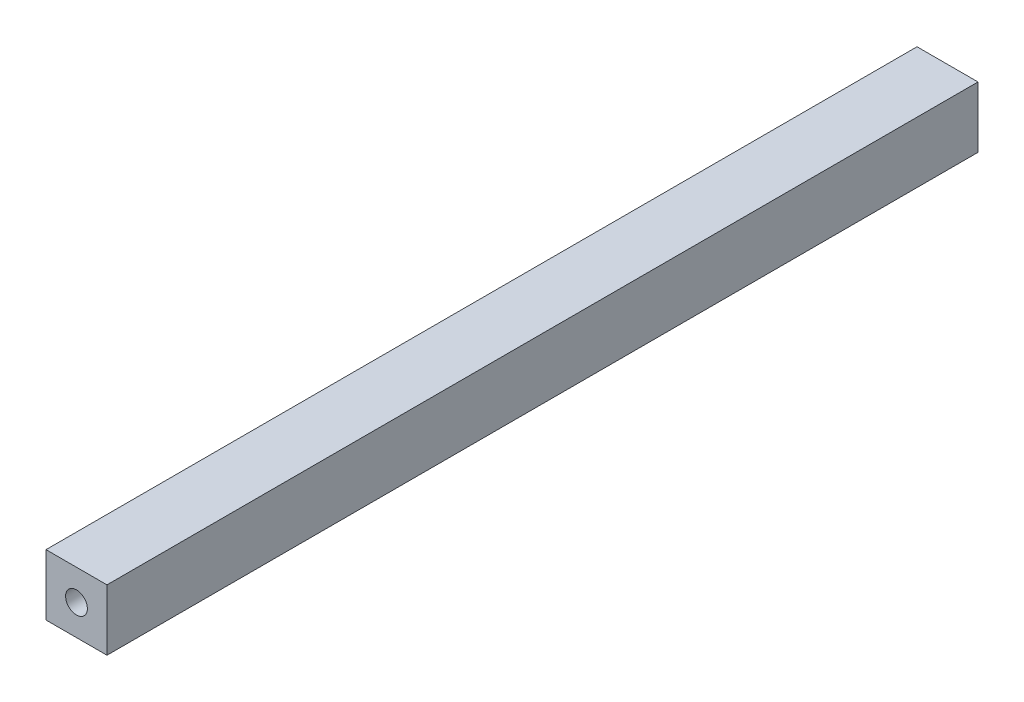
ISO-10303-21;
HEADER;
FILE_DESCRIPTION(('STEP AP214'),'2;1');
FILE_NAME('part.step','',(''),(''),'','','');
FILE_SCHEMA(('AUTOMOTIVE_DESIGN { 1 0 10303 214 1 1 1 1 }'));
ENDSEC;
DATA;
#1=APPLICATION_CONTEXT('core data for automotive mechanical design processes');
#2=APPLICATION_PROTOCOL_DEFINITION('international standard','automotive_design',2000,#1);
#3=PRODUCT_CONTEXT('',#1,'mechanical');
#4=PRODUCT('Part','Part','',(#3));
#5=PRODUCT_RELATED_PRODUCT_CATEGORY('part','',(#4));
#6=PRODUCT_DEFINITION_FORMATION('','',#4);
#7=PRODUCT_DEFINITION_CONTEXT('part definition',#1,'design');
#8=PRODUCT_DEFINITION('design','',#6,#7);
#9=PRODUCT_DEFINITION_SHAPE('','',#8);
#10=(LENGTH_UNIT() NAMED_UNIT(*) SI_UNIT(.MILLI.,.METRE.));
#11=(NAMED_UNIT(*) PLANE_ANGLE_UNIT() SI_UNIT($,.RADIAN.));
#12=(NAMED_UNIT(*) SI_UNIT($,.STERADIAN.) SOLID_ANGLE_UNIT());
#13=UNCERTAINTY_MEASURE_WITH_UNIT(LENGTH_MEASURE(1.E-05),#10,'distance_accuracy_value','');
#14=(GEOMETRIC_REPRESENTATION_CONTEXT(3) GLOBAL_UNCERTAINTY_ASSIGNED_CONTEXT((#13)) GLOBAL_UNIT_ASSIGNED_CONTEXT((#10,
#11,#12)) REPRESENTATION_CONTEXT('',''));
#15=CARTESIAN_POINT('',(0.,0.,0.));
#16=DIRECTION('',(0.,0.,1.));
#17=DIRECTION('',(1.,0.,0.));
#18=AXIS2_PLACEMENT_3D('',#15,#16,#17);
#19=CARTESIAN_POINT('',(17.78,17.78,508.));
#20=DIRECTION('',(-1.,0.,0.));
#21=DIRECTION('',(0.,-1.,0.));
#22=AXIS2_PLACEMENT_3D('',#19,#20,#21);
#23=PLANE('',#22);
#24=DIRECTION('',(0.,1.,0.));
#25=VECTOR('',#24,1.);
#26=CARTESIAN_POINT('',(17.78,17.78,0.));
#27=LINE('',#26,#25);
#28=CARTESIAN_POINT('',(17.78,-17.78,0.));
#29=VERTEX_POINT('',#28);
#30=CARTESIAN_POINT('',(17.78,17.78,0.));
#31=VERTEX_POINT('',#30);
#32=EDGE_CURVE('E119',#29,#31,#27,.T.);
#33=ORIENTED_EDGE('',*,*,#32,.T.);
#34=DIRECTION('',(0.,0.,-1.));
#35=VECTOR('',#34,1.);
#36=CARTESIAN_POINT('',(17.78,17.78,508.));
#37=LINE('',#36,#35);
#38=CARTESIAN_POINT('',(17.78,17.78,508.));
#39=VERTEX_POINT('',#38);
#40=EDGE_CURVE('E11',#39,#31,#37,.T.);
#41=ORIENTED_EDGE('',*,*,#40,.F.);
#42=DIRECTION('',(0.,1.,0.));
#43=VECTOR('',#42,1.);
#44=CARTESIAN_POINT('',(17.78,17.78,508.));
#45=LINE('',#44,#43);
#46=CARTESIAN_POINT('',(17.78,-17.78,508.));
#47=VERTEX_POINT('',#46);
#48=EDGE_CURVE('E101',#47,#39,#45,.T.);
#49=ORIENTED_EDGE('',*,*,#48,.F.);
#50=DIRECTION('',(0.,0.,-1.));
#51=VECTOR('',#50,1.);
#52=CARTESIAN_POINT('',(17.78,-17.78,508.));
#53=LINE('',#52,#51);
#54=EDGE_CURVE('E115',#47,#29,#53,.T.);
#55=ORIENTED_EDGE('',*,*,#54,.T.);
#56=EDGE_LOOP('',(#33,#41,#49,#55));
#57=FACE_BOUND('',#56,.T.);
#58=ADVANCED_FACE('F49',(#57),#23,.F.);
#59=CARTESIAN_POINT('',(-17.78,17.78,508.));
#60=DIRECTION('',(0.,-1.,0.));
#61=DIRECTION('',(0.,0.,-1.));
#62=AXIS2_PLACEMENT_3D('',#59,#60,#61);
#63=PLANE('',#62);
#64=DIRECTION('',(-1.,0.,0.));
#65=VECTOR('',#64,1.);
#66=CARTESIAN_POINT('',(-17.78,17.78,0.));
#67=LINE('',#66,#65);
#68=CARTESIAN_POINT('',(-17.78,17.78,0.));
#69=VERTEX_POINT('',#68);
#70=EDGE_CURVE('E106',#31,#69,#67,.T.);
#71=ORIENTED_EDGE('',*,*,#70,.T.);
#72=DIRECTION('',(0.,0.,-1.));
#73=VECTOR('',#72,1.);
#74=CARTESIAN_POINT('',(-17.78,17.78,508.));
#75=LINE('',#74,#73);
#76=CARTESIAN_POINT('',(-17.78,17.78,508.));
#77=VERTEX_POINT('',#76);
#78=EDGE_CURVE('E58',#77,#69,#75,.T.);
#79=ORIENTED_EDGE('',*,*,#78,.F.);
#80=DIRECTION('',(-1.,0.,0.));
#81=VECTOR('',#80,1.);
#82=CARTESIAN_POINT('',(-17.78,17.78,508.));
#83=LINE('',#82,#81);
#84=EDGE_CURVE('E96',#39,#77,#83,.T.);
#85=ORIENTED_EDGE('',*,*,#84,.F.);
#86=ORIENTED_EDGE('',*,*,#40,.T.);
#87=EDGE_LOOP('',(#71,#79,#85,#86));
#88=FACE_BOUND('',#87,.T.);
#89=ADVANCED_FACE('F105',(#88),#63,.F.);
#90=CARTESIAN_POINT('',(-17.78,17.78,508.));
#91=DIRECTION('',(1.,0.,0.));
#92=DIRECTION('',(0.,1.,0.));
#93=AXIS2_PLACEMENT_3D('',#90,#91,#92);
#94=PLANE('',#93);
#95=DIRECTION('',(0.,-1.,0.));
#96=VECTOR('',#95,1.);
#97=CARTESIAN_POINT('',(-17.78,17.78,0.));
#98=LINE('',#97,#96);
#99=CARTESIAN_POINT('',(-17.78,-17.78,0.));
#100=VERTEX_POINT('',#99);
#101=EDGE_CURVE('E83',#69,#100,#98,.T.);
#102=ORIENTED_EDGE('',*,*,#101,.T.);
#103=DIRECTION('',(0.,0.,-1.));
#104=VECTOR('',#103,1.);
#105=CARTESIAN_POINT('',(-17.78,-17.78,508.));
#106=LINE('',#105,#104);
#107=CARTESIAN_POINT('',(-17.78,-17.78,508.));
#108=VERTEX_POINT('',#107);
#109=EDGE_CURVE('E108',#108,#100,#106,.T.);
#110=ORIENTED_EDGE('',*,*,#109,.F.);
#111=DIRECTION('',(0.,-1.,0.));
#112=VECTOR('',#111,1.);
#113=CARTESIAN_POINT('',(-17.78,17.78,508.));
#114=LINE('',#113,#112);
#115=EDGE_CURVE('E99',#77,#108,#114,.T.);
#116=ORIENTED_EDGE('',*,*,#115,.F.);
#117=ORIENTED_EDGE('',*,*,#78,.T.);
#118=EDGE_LOOP('',(#102,#110,#116,#117));
#119=FACE_BOUND('',#118,.T.);
#120=ADVANCED_FACE('F109',(#119),#94,.F.);
#121=CARTESIAN_POINT('',(-17.78,-17.78,508.));
#122=DIRECTION('',(0.,1.,0.));
#123=DIRECTION('',(0.,0.,1.));
#124=AXIS2_PLACEMENT_3D('',#121,#122,#123);
#125=PLANE('',#124);
#126=DIRECTION('',(1.,0.,0.));
#127=VECTOR('',#126,1.);
#128=CARTESIAN_POINT('',(-17.78,-17.78,0.));
#129=LINE('',#128,#127);
#130=EDGE_CURVE('E89',#100,#29,#129,.T.);
#131=ORIENTED_EDGE('',*,*,#130,.T.);
#132=ORIENTED_EDGE('',*,*,#54,.F.);
#133=DIRECTION('',(1.,0.,0.));
#134=VECTOR('',#133,1.);
#135=CARTESIAN_POINT('',(-17.78,-17.78,508.));
#136=LINE('',#135,#134);
#137=EDGE_CURVE('E66',#108,#47,#136,.T.);
#138=ORIENTED_EDGE('',*,*,#137,.F.);
#139=ORIENTED_EDGE('',*,*,#109,.T.);
#140=EDGE_LOOP('',(#131,#132,#138,#139));
#141=FACE_BOUND('',#140,.T.);
#142=ADVANCED_FACE('F135',(#141),#125,.F.);
#143=CARTESIAN_POINT('',(0.,0.,508.));
#144=DIRECTION('',(0.,0.,1.));
#145=DIRECTION('',(1.,0.,0.));
#146=AXIS2_PLACEMENT_3D('',#143,#144,#145);
#147=PLANE('',#146);
#148=CARTESIAN_POINT('',(0.,0.,508.));
#149=DIRECTION('',(0.,0.,1.));
#150=DIRECTION('',(1.,0.,0.));
#151=AXIS2_PLACEMENT_3D('',#148,#149,#150);
#152=CIRCLE('',#151,6.35);
#153=CARTESIAN_POINT('',(6.35,0.,508.));
#154=VERTEX_POINT('',#153);
#155=EDGE_CURVE('E144',#154,#154,#152,.T.);
#156=ORIENTED_EDGE('',*,*,#155,.F.);
#157=EDGE_LOOP('',(#156));
#158=FACE_BOUND('',#157,.T.);
#159=ORIENTED_EDGE('',*,*,#48,.T.);
#160=ORIENTED_EDGE('',*,*,#84,.T.);
#161=ORIENTED_EDGE('',*,*,#115,.T.);
#162=ORIENTED_EDGE('',*,*,#137,.T.);
#163=EDGE_LOOP('',(#159,#160,#161,#162));
#164=FACE_BOUND('',#163,.T.);
#165=ADVANCED_FACE('F97',(#158,#164),#147,.T.);
#166=CARTESIAN_POINT('',(0.,0.,0.));
#167=DIRECTION('',(0.,0.,1.));
#168=DIRECTION('',(1.,0.,0.));
#169=AXIS2_PLACEMENT_3D('',#166,#167,#168);
#170=PLANE('',#169);
#171=CARTESIAN_POINT('',(0.,0.,0.));
#172=DIRECTION('',(0.,0.,1.));
#173=DIRECTION('',(1.,0.,0.));
#174=AXIS2_PLACEMENT_3D('',#171,#172,#173);
#175=CIRCLE('',#174,6.35);
#176=CARTESIAN_POINT('',(6.35,0.,0.));
#177=VERTEX_POINT('',#176);
#178=EDGE_CURVE('E123',#177,#177,#175,.T.);
#179=ORIENTED_EDGE('',*,*,#178,.T.);
#180=EDGE_LOOP('',(#179));
#181=FACE_BOUND('',#180,.T.);
#182=ORIENTED_EDGE('',*,*,#32,.F.);
#183=ORIENTED_EDGE('',*,*,#130,.F.);
#184=ORIENTED_EDGE('',*,*,#101,.F.);
#185=ORIENTED_EDGE('',*,*,#70,.F.);
#186=EDGE_LOOP('',(#182,#183,#184,#185));
#187=FACE_BOUND('',#186,.T.);
#188=ADVANCED_FACE('F138',(#181,#187),#170,.F.);
#189=CARTESIAN_POINT('',(0.,0.,0.));
#190=DIRECTION('',(0.,0.,1.));
#191=DIRECTION('',(1.,0.,0.));
#192=AXIS2_PLACEMENT_3D('',#189,#190,#191);
#193=CYLINDRICAL_SURFACE('',#192,6.35);
#194=ORIENTED_EDGE('',*,*,#178,.F.);
#195=EDGE_LOOP('',(#194));
#196=FACE_BOUND('',#195,.T.);
#197=ORIENTED_EDGE('',*,*,#155,.T.);
#198=EDGE_LOOP('',(#197));
#199=FACE_BOUND('',#198,.T.);
#200=ADVANCED_FACE('F155',(#196,#199),#193,.F.);
#201=CLOSED_SHELL('',(#58,#89,#120,#142,#165,#188,#200));
#202=MANIFOLD_SOLID_BREP('B2',#201);
#203=ADVANCED_BREP_SHAPE_REPRESENTATION('',(#18,#202),#14);
#204=SHAPE_DEFINITION_REPRESENTATION(#9,#203);
ENDSEC;
END-ISO-10303-21;
